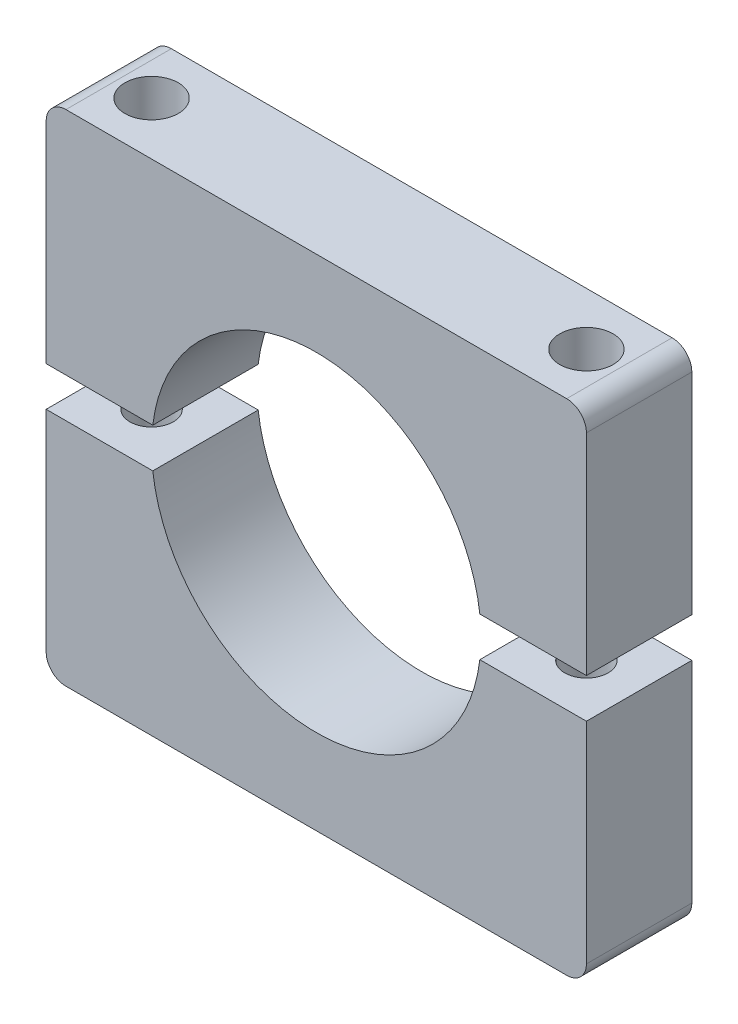
ISO-10303-21;
HEADER;
FILE_DESCRIPTION(('STEP AP214'),'2;1');
FILE_NAME('part.step','',(''),(''),'','','');
FILE_SCHEMA(('AUTOMOTIVE_DESIGN { 1 0 10303 214 1 1 1 1 }'));
ENDSEC;
DATA;
#1=APPLICATION_CONTEXT('core data for automotive mechanical design processes');
#2=APPLICATION_PROTOCOL_DEFINITION('international standard','automotive_design',2000,#1);
#3=PRODUCT_CONTEXT('',#1,'mechanical');
#4=PRODUCT('Part','Part','',(#3));
#5=PRODUCT_RELATED_PRODUCT_CATEGORY('part','',(#4));
#6=PRODUCT_DEFINITION_FORMATION('','',#4);
#7=PRODUCT_DEFINITION_CONTEXT('part definition',#1,'design');
#8=PRODUCT_DEFINITION('design','',#6,#7);
#9=PRODUCT_DEFINITION_SHAPE('','',#8);
#10=(LENGTH_UNIT() NAMED_UNIT(*) SI_UNIT(.MILLI.,.METRE.));
#11=(NAMED_UNIT(*) PLANE_ANGLE_UNIT() SI_UNIT($,.RADIAN.));
#12=(NAMED_UNIT(*) SI_UNIT($,.STERADIAN.) SOLID_ANGLE_UNIT());
#13=UNCERTAINTY_MEASURE_WITH_UNIT(LENGTH_MEASURE(1.E-05),#10,'distance_accuracy_value','');
#14=(GEOMETRIC_REPRESENTATION_CONTEXT(3) GLOBAL_UNCERTAINTY_ASSIGNED_CONTEXT((#13)) GLOBAL_UNIT_ASSIGNED_CONTEXT((#10,
#11,#12)) REPRESENTATION_CONTEXT('',''));
#15=CARTESIAN_POINT('',(0.,0.,0.));
#16=DIRECTION('',(0.,0.,1.));
#17=DIRECTION('',(1.,0.,0.));
#18=AXIS2_PLACEMENT_3D('',#15,#16,#17);
#19=CARTESIAN_POINT('',(0.,0.,4.));
#20=DIRECTION('',(0.,0.,-1.));
#21=DIRECTION('',(-1.,0.,0.));
#22=AXIS2_PLACEMENT_3D('',#19,#20,#21);
#23=PLANE('',#22);
#24=DIRECTION('',(0.,1.,0.));
#25=VECTOR('',#24,1.);
#26=CARTESIAN_POINT('',(20.5,-18.95,4.));
#27=LINE('',#26,#25);
#28=CARTESIAN_POINT('',(20.5,-17.45,4.));
#29=VERTEX_POINT('',#28);
#30=CARTESIAN_POINT('',(20.5,-1.5,4.));
#31=VERTEX_POINT('',#30);
#32=EDGE_CURVE('E118',#29,#31,#27,.T.);
#33=ORIENTED_EDGE('',*,*,#32,.T.);
#34=DIRECTION('',(-1.,0.,0.));
#35=VECTOR('',#34,1.);
#36=CARTESIAN_POINT('',(0.,-1.5,4.));
#37=LINE('',#36,#35);
#38=CARTESIAN_POINT('',(12.4096736459909,-1.5,4.));
#39=VERTEX_POINT('',#38);
#40=EDGE_CURVE('E132',#31,#39,#37,.T.);
#41=ORIENTED_EDGE('',*,*,#40,.T.);
#42=CARTESIAN_POINT('',(0.,0.,4.));
#43=DIRECTION('',(0.,0.,1.));
#44=DIRECTION('',(1.,0.,0.));
#45=AXIS2_PLACEMENT_3D('',#42,#43,#44);
#46=CIRCLE('',#45,12.5);
#47=CARTESIAN_POINT('',(-12.4096736459909,-1.5,4.));
#48=VERTEX_POINT('',#47);
#49=EDGE_CURVE('E150',#48,#39,#46,.T.);
#50=ORIENTED_EDGE('',*,*,#49,.F.);
#51=CARTESIAN_POINT('',(-20.5,-1.5,4.));
#52=VERTEX_POINT('',#51);
#53=EDGE_CURVE('E87',#48,#52,#37,.T.);
#54=ORIENTED_EDGE('',*,*,#53,.T.);
#55=DIRECTION('',(0.,-1.,0.));
#56=VECTOR('',#55,1.);
#57=CARTESIAN_POINT('',(-20.5,-18.95,4.));
#58=LINE('',#57,#56);
#59=CARTESIAN_POINT('',(-20.5,-17.45,4.));
#60=VERTEX_POINT('',#59);
#61=EDGE_CURVE('E156',#52,#60,#58,.T.);
#62=ORIENTED_EDGE('',*,*,#61,.T.);
#63=CARTESIAN_POINT('',(-19.,-17.45,4.));
#64=DIRECTION('',(0.,0.,-1.));
#65=DIRECTION('',(-1.,0.,0.));
#66=AXIS2_PLACEMENT_3D('',#63,#64,#65);
#67=CIRCLE('',#66,1.5);
#68=CARTESIAN_POINT('',(-19.,-18.95,4.));
#69=VERTEX_POINT('',#68);
#70=EDGE_CURVE('E151',#60,#69,#67,.F.);
#71=ORIENTED_EDGE('',*,*,#70,.T.);
#72=DIRECTION('',(1.,0.,0.));
#73=VECTOR('',#72,1.);
#74=CARTESIAN_POINT('',(-20.5,-18.95,4.));
#75=LINE('',#74,#73);
#76=CARTESIAN_POINT('',(19.,-18.95,4.));
#77=VERTEX_POINT('',#76);
#78=EDGE_CURVE('E120',#69,#77,#75,.T.);
#79=ORIENTED_EDGE('',*,*,#78,.T.);
#80=CARTESIAN_POINT('',(19.,-17.45,4.));
#81=DIRECTION('',(0.,0.,-1.));
#82=DIRECTION('',(-1.,0.,0.));
#83=AXIS2_PLACEMENT_3D('',#80,#81,#82);
#84=CIRCLE('',#83,1.5);
#85=EDGE_CURVE('E115',#77,#29,#84,.F.);
#86=ORIENTED_EDGE('',*,*,#85,.T.);
#87=EDGE_LOOP('',(#33,#41,#50,#54,#62,#71,#79,#86));
#88=FACE_BOUND('',#87,.T.);
#89=ADVANCED_FACE('F48',(#88),#23,.F.);
#90=CARTESIAN_POINT('',(0.,0.,-4.));
#91=DIRECTION('',(0.,0.,-1.));
#92=DIRECTION('',(-1.,0.,0.));
#93=AXIS2_PLACEMENT_3D('',#90,#91,#92);
#94=PLANE('',#93);
#95=DIRECTION('',(-1.,0.,0.));
#96=VECTOR('',#95,1.);
#97=CARTESIAN_POINT('',(0.,-1.5,-4.));
#98=LINE('',#97,#96);
#99=CARTESIAN_POINT('',(20.5,-1.5,-4.));
#100=VERTEX_POINT('',#99);
#101=CARTESIAN_POINT('',(12.4096736459909,-1.5,-4.));
#102=VERTEX_POINT('',#101);
#103=EDGE_CURVE('E59',#100,#102,#98,.T.);
#104=ORIENTED_EDGE('',*,*,#103,.F.);
#105=DIRECTION('',(0.,1.,0.));
#106=VECTOR('',#105,1.);
#107=CARTESIAN_POINT('',(20.5,-18.95,-4.));
#108=LINE('',#107,#106);
#109=CARTESIAN_POINT('',(20.5,-17.45,-4.));
#110=VERTEX_POINT('',#109);
#111=EDGE_CURVE('E140',#110,#100,#108,.T.);
#112=ORIENTED_EDGE('',*,*,#111,.F.);
#113=CARTESIAN_POINT('',(19.,-17.45,-4.));
#114=DIRECTION('',(0.,0.,-1.));
#115=DIRECTION('',(-1.,0.,0.));
#116=AXIS2_PLACEMENT_3D('',#113,#114,#115);
#117=CIRCLE('',#116,1.5);
#118=CARTESIAN_POINT('',(19.,-18.95,-4.));
#119=VERTEX_POINT('',#118);
#120=EDGE_CURVE('E124',#110,#119,#117,.T.);
#121=ORIENTED_EDGE('',*,*,#120,.T.);
#122=DIRECTION('',(1.,0.,0.));
#123=VECTOR('',#122,1.);
#124=CARTESIAN_POINT('',(-20.5,-18.95,-4.));
#125=LINE('',#124,#123);
#126=CARTESIAN_POINT('',(-19.,-18.95,-4.));
#127=VERTEX_POINT('',#126);
#128=EDGE_CURVE('E146',#127,#119,#125,.T.);
#129=ORIENTED_EDGE('',*,*,#128,.F.);
#130=CARTESIAN_POINT('',(-19.,-17.45,-4.));
#131=DIRECTION('',(0.,0.,-1.));
#132=DIRECTION('',(-1.,0.,0.));
#133=AXIS2_PLACEMENT_3D('',#130,#131,#132);
#134=CIRCLE('',#133,1.5);
#135=CARTESIAN_POINT('',(-20.5,-17.45,-4.));
#136=VERTEX_POINT('',#135);
#137=EDGE_CURVE('E144',#127,#136,#134,.T.);
#138=ORIENTED_EDGE('',*,*,#137,.T.);
#139=DIRECTION('',(0.,-1.,0.));
#140=VECTOR('',#139,1.);
#141=CARTESIAN_POINT('',(-20.5,-18.95,-4.));
#142=LINE('',#141,#140);
#143=CARTESIAN_POINT('',(-20.5,-1.5,-4.));
#144=VERTEX_POINT('',#143);
#145=EDGE_CURVE('E138',#144,#136,#142,.T.);
#146=ORIENTED_EDGE('',*,*,#145,.F.);
#147=CARTESIAN_POINT('',(-12.4096736459909,-1.5,-4.));
#148=VERTEX_POINT('',#147);
#149=EDGE_CURVE('E12',#148,#144,#98,.T.);
#150=ORIENTED_EDGE('',*,*,#149,.F.);
#151=CARTESIAN_POINT('',(0.,0.,-4.));
#152=DIRECTION('',(0.,0.,1.));
#153=DIRECTION('',(1.,0.,0.));
#154=AXIS2_PLACEMENT_3D('',#151,#152,#153);
#155=CIRCLE('',#154,12.5);
#156=EDGE_CURVE('E51',#148,#102,#155,.T.);
#157=ORIENTED_EDGE('',*,*,#156,.T.);
#158=EDGE_LOOP('',(#104,#112,#121,#129,#138,#146,#150,#157));
#159=FACE_BOUND('',#158,.T.);
#160=ADVANCED_FACE('F183',(#159),#94,.T.);
#161=CARTESIAN_POINT('',(20.5,-18.95,4.));
#162=DIRECTION('',(-1.,0.,0.));
#163=DIRECTION('',(0.,0.,1.));
#164=AXIS2_PLACEMENT_3D('',#161,#162,#163);
#165=PLANE('',#164);
#166=ORIENTED_EDGE('',*,*,#111,.T.);
#167=DIRECTION('',(0.,0.,1.));
#168=VECTOR('',#167,1.);
#169=CARTESIAN_POINT('',(20.5,-1.5,4.));
#170=LINE('',#169,#168);
#171=EDGE_CURVE('E84',#100,#31,#170,.T.);
#172=ORIENTED_EDGE('',*,*,#171,.T.);
#173=ORIENTED_EDGE('',*,*,#32,.F.);
#174=DIRECTION('',(0.,0.,-1.));
#175=VECTOR('',#174,1.);
#176=CARTESIAN_POINT('',(20.5,-17.45,4.));
#177=LINE('',#176,#175);
#178=EDGE_CURVE('E130',#29,#110,#177,.T.);
#179=ORIENTED_EDGE('',*,*,#178,.T.);
#180=EDGE_LOOP('',(#166,#172,#173,#179));
#181=FACE_BOUND('',#180,.T.);
#182=ADVANCED_FACE('F129',(#181),#165,.F.);
#183=CARTESIAN_POINT('',(-20.5,-18.95,4.));
#184=DIRECTION('',(1.,0.,0.));
#185=DIRECTION('',(0.,0.,-1.));
#186=AXIS2_PLACEMENT_3D('',#183,#184,#185);
#187=PLANE('',#186);
#188=ORIENTED_EDGE('',*,*,#61,.F.);
#189=DIRECTION('',(0.,0.,-1.));
#190=VECTOR('',#189,1.);
#191=CARTESIAN_POINT('',(-20.5,-1.5,4.));
#192=LINE('',#191,#190);
#193=EDGE_CURVE('E66',#52,#144,#192,.T.);
#194=ORIENTED_EDGE('',*,*,#193,.T.);
#195=ORIENTED_EDGE('',*,*,#145,.T.);
#196=DIRECTION('',(0.,0.,-1.));
#197=VECTOR('',#196,1.);
#198=CARTESIAN_POINT('',(-20.5,-17.45,4.));
#199=LINE('',#198,#197);
#200=EDGE_CURVE('E159',#136,#60,#199,.F.);
#201=ORIENTED_EDGE('',*,*,#200,.T.);
#202=EDGE_LOOP('',(#188,#194,#195,#201));
#203=FACE_BOUND('',#202,.T.);
#204=ADVANCED_FACE('F223',(#203),#187,.F.);
#205=CARTESIAN_POINT('',(0.,0.,4.));
#206=DIRECTION('',(0.,0.,-1.));
#207=DIRECTION('',(-1.,0.,0.));
#208=AXIS2_PLACEMENT_3D('',#205,#206,#207);
#209=CYLINDRICAL_SURFACE('',#208,12.5);
#210=DIRECTION('',(0.,0.,-1.));
#211=VECTOR('',#210,1.);
#212=CARTESIAN_POINT('',(-12.4096736459909,-1.5,4.));
#213=LINE('',#212,#211);
#214=EDGE_CURVE('E57',#48,#148,#213,.T.);
#215=ORIENTED_EDGE('',*,*,#214,.F.);
#216=ORIENTED_EDGE('',*,*,#49,.T.);
#217=DIRECTION('',(0.,0.,-1.));
#218=VECTOR('',#217,1.);
#219=CARTESIAN_POINT('',(12.4096736459909,-1.5,4.));
#220=LINE('',#219,#218);
#221=EDGE_CURVE('E154',#102,#39,#220,.F.);
#222=ORIENTED_EDGE('',*,*,#221,.F.);
#223=ORIENTED_EDGE('',*,*,#156,.F.);
#224=EDGE_LOOP('',(#215,#216,#222,#223));
#225=FACE_BOUND('',#224,.T.);
#226=ADVANCED_FACE('F184',(#225),#209,.F.);
#227=CARTESIAN_POINT('',(-20.5,-18.95,4.));
#228=DIRECTION('',(0.,1.,0.));
#229=DIRECTION('',(0.,0.,1.));
#230=AXIS2_PLACEMENT_3D('',#227,#228,#229);
#231=PLANE('',#230);
#232=CARTESIAN_POINT('',(-16.5,-18.95,0.));
#233=DIRECTION('',(0.,1.,0.));
#234=DIRECTION('',(0.,0.,1.));
#235=AXIS2_PLACEMENT_3D('',#232,#233,#234);
#236=CIRCLE('',#235,1.65);
#237=CARTESIAN_POINT('',(-16.5,-18.95,1.65));
#238=VERTEX_POINT('',#237);
#239=EDGE_CURVE('E192',#238,#238,#236,.T.);
#240=ORIENTED_EDGE('',*,*,#239,.T.);
#241=EDGE_LOOP('',(#240));
#242=FACE_BOUND('',#241,.T.);
#243=CARTESIAN_POINT('',(16.5,-18.95,0.));
#244=DIRECTION('',(0.,1.,0.));
#245=DIRECTION('',(0.,0.,1.));
#246=AXIS2_PLACEMENT_3D('',#243,#244,#245);
#247=CIRCLE('',#246,1.65);
#248=CARTESIAN_POINT('',(16.5,-18.95,1.65));
#249=VERTEX_POINT('',#248);
#250=EDGE_CURVE('E133',#249,#249,#247,.T.);
#251=ORIENTED_EDGE('',*,*,#250,.T.);
#252=EDGE_LOOP('',(#251));
#253=FACE_BOUND('',#252,.T.);
#254=ORIENTED_EDGE('',*,*,#128,.T.);
#255=DIRECTION('',(0.,0.,-1.));
#256=VECTOR('',#255,1.);
#257=CARTESIAN_POINT('',(19.,-18.95,4.));
#258=LINE('',#257,#256);
#259=EDGE_CURVE('E149',#119,#77,#258,.F.);
#260=ORIENTED_EDGE('',*,*,#259,.T.);
#261=ORIENTED_EDGE('',*,*,#78,.F.);
#262=DIRECTION('',(0.,0.,-1.));
#263=VECTOR('',#262,1.);
#264=CARTESIAN_POINT('',(-19.,-18.95,4.));
#265=LINE('',#264,#263);
#266=EDGE_CURVE('E155',#69,#127,#265,.T.);
#267=ORIENTED_EDGE('',*,*,#266,.T.);
#268=EDGE_LOOP('',(#254,#260,#261,#267));
#269=FACE_BOUND('',#268,.T.);
#270=ADVANCED_FACE('F228',(#242,#253,#269),#231,.F.);
#271=CARTESIAN_POINT('',(19.,-17.45,4.));
#272=DIRECTION('',(0.,0.,-1.));
#273=DIRECTION('',(-1.,0.,0.));
#274=AXIS2_PLACEMENT_3D('',#271,#272,#273);
#275=CYLINDRICAL_SURFACE('',#274,1.5);
#276=ORIENTED_EDGE('',*,*,#85,.F.);
#277=ORIENTED_EDGE('',*,*,#259,.F.);
#278=ORIENTED_EDGE('',*,*,#120,.F.);
#279=ORIENTED_EDGE('',*,*,#178,.F.);
#280=EDGE_LOOP('',(#276,#277,#278,#279));
#281=FACE_BOUND('',#280,.T.);
#282=ADVANCED_FACE('F136',(#281),#275,.T.);
#283=CARTESIAN_POINT('',(-19.,-17.45,4.));
#284=DIRECTION('',(0.,0.,-1.));
#285=DIRECTION('',(-1.,0.,0.));
#286=AXIS2_PLACEMENT_3D('',#283,#284,#285);
#287=CYLINDRICAL_SURFACE('',#286,1.5);
#288=ORIENTED_EDGE('',*,*,#70,.F.);
#289=ORIENTED_EDGE('',*,*,#200,.F.);
#290=ORIENTED_EDGE('',*,*,#137,.F.);
#291=ORIENTED_EDGE('',*,*,#266,.F.);
#292=EDGE_LOOP('',(#288,#289,#290,#291));
#293=FACE_BOUND('',#292,.T.);
#294=ADVANCED_FACE('F212',(#293),#287,.T.);
#295=CARTESIAN_POINT('',(-25.,-1.5,-15.));
#296=DIRECTION('',(0.,-1.,0.));
#297=DIRECTION('',(0.,0.,-1.));
#298=AXIS2_PLACEMENT_3D('',#295,#296,#297);
#299=PLANE('',#298);
#300=CARTESIAN_POINT('',(16.5,-1.5,0.));
#301=DIRECTION('',(0.,1.,0.));
#302=DIRECTION('',(0.,0.,1.));
#303=AXIS2_PLACEMENT_3D('',#300,#301,#302);
#304=CIRCLE('',#303,1.64999999999999);
#305=CARTESIAN_POINT('',(16.5,-1.5,1.64999999999999));
#306=VERTEX_POINT('',#305);
#307=EDGE_CURVE('E189',#306,#306,#304,.T.);
#308=ORIENTED_EDGE('',*,*,#307,.F.);
#309=EDGE_LOOP('',(#308));
#310=FACE_BOUND('',#309,.T.);
#311=ORIENTED_EDGE('',*,*,#103,.T.);
#312=ORIENTED_EDGE('',*,*,#221,.T.);
#313=ORIENTED_EDGE('',*,*,#40,.F.);
#314=ORIENTED_EDGE('',*,*,#171,.F.);
#315=EDGE_LOOP('',(#311,#312,#313,#314));
#316=FACE_BOUND('',#315,.T.);
#317=ADVANCED_FACE('F204',(#310,#316),#299,.F.);
#318=CARTESIAN_POINT('',(-16.5,-1.5,0.));
#319=DIRECTION('',(0.,1.,0.));
#320=DIRECTION('',(0.,0.,1.));
#321=AXIS2_PLACEMENT_3D('',#318,#319,#320);
#322=CIRCLE('',#321,1.64999999999999);
#323=CARTESIAN_POINT('',(-16.5,-1.5,1.64999999999999));
#324=VERTEX_POINT('',#323);
#325=EDGE_CURVE('E195',#324,#324,#322,.T.);
#326=ORIENTED_EDGE('',*,*,#325,.F.);
#327=EDGE_LOOP('',(#326));
#328=FACE_BOUND('',#327,.T.);
#329=ORIENTED_EDGE('',*,*,#53,.F.);
#330=ORIENTED_EDGE('',*,*,#214,.T.);
#331=ORIENTED_EDGE('',*,*,#149,.T.);
#332=ORIENTED_EDGE('',*,*,#193,.F.);
#333=EDGE_LOOP('',(#329,#330,#331,#332));
#334=FACE_BOUND('',#333,.T.);
#335=ADVANCED_FACE('F201',(#328,#334),#299,.F.);
#336=CARTESIAN_POINT('',(16.5,-1.5,0.));
#337=DIRECTION('',(0.,1.,0.));
#338=DIRECTION('',(0.,0.,1.));
#339=AXIS2_PLACEMENT_3D('',#336,#337,#338);
#340=CYLINDRICAL_SURFACE('',#339,1.64999999999999);
#341=ORIENTED_EDGE('',*,*,#250,.F.);
#342=EDGE_LOOP('',(#341));
#343=FACE_BOUND('',#342,.T.);
#344=ORIENTED_EDGE('',*,*,#307,.T.);
#345=EDGE_LOOP('',(#344));
#346=FACE_BOUND('',#345,.T.);
#347=ADVANCED_FACE('F203',(#343,#346),#340,.F.);
#348=CARTESIAN_POINT('',(-16.5,-1.5,0.));
#349=DIRECTION('',(0.,1.,0.));
#350=DIRECTION('',(0.,0.,1.));
#351=AXIS2_PLACEMENT_3D('',#348,#349,#350);
#352=CYLINDRICAL_SURFACE('',#351,1.64999999999999);
#353=ORIENTED_EDGE('',*,*,#239,.F.);
#354=EDGE_LOOP('',(#353));
#355=FACE_BOUND('',#354,.T.);
#356=ORIENTED_EDGE('',*,*,#325,.T.);
#357=EDGE_LOOP('',(#356));
#358=FACE_BOUND('',#357,.T.);
#359=ADVANCED_FACE('F199',(#355,#358),#352,.F.);
#360=CLOSED_SHELL('',(#89,#160,#182,#204,#226,#270,#282,#294,#317,#335,#347,#359));
#361=MANIFOLD_SOLID_BREP('B2',#360);
#362=CARTESIAN_POINT('',(-20.5,18.95,4.));
#363=DIRECTION('',(0.,-1.,0.));
#364=DIRECTION('',(0.,0.,-1.));
#365=AXIS2_PLACEMENT_3D('',#362,#363,#364);
#366=PLANE('',#365);
#367=CARTESIAN_POINT('',(16.5,18.95,0.));
#368=DIRECTION('',(0.,-1.,0.));
#369=DIRECTION('',(0.,0.,-1.));
#370=AXIS2_PLACEMENT_3D('',#367,#368,#369);
#371=CIRCLE('',#370,2.025);
#372=CARTESIAN_POINT('',(16.5,18.95,-2.025));
#373=VERTEX_POINT('',#372);
#374=EDGE_CURVE('E442',#373,#373,#371,.T.);
#375=ORIENTED_EDGE('',*,*,#374,.T.);
#376=EDGE_LOOP('',(#375));
#377=FACE_BOUND('',#376,.T.);
#378=CARTESIAN_POINT('',(-16.5,18.95,0.));
#379=DIRECTION('',(0.,-1.,0.));
#380=DIRECTION('',(0.,0.,-1.));
#381=AXIS2_PLACEMENT_3D('',#378,#379,#380);
#382=CIRCLE('',#381,2.025);
#383=CARTESIAN_POINT('',(-16.5,18.95,-2.02499999999999));
#384=VERTEX_POINT('',#383);
#385=EDGE_CURVE('E450',#384,#384,#382,.T.);
#386=ORIENTED_EDGE('',*,*,#385,.T.);
#387=EDGE_LOOP('',(#386));
#388=FACE_BOUND('',#387,.T.);
#389=DIRECTION('',(-1.,0.,0.));
#390=VECTOR('',#389,1.);
#391=CARTESIAN_POINT('',(-20.5,18.95,-4.));
#392=LINE('',#391,#390);
#393=CARTESIAN_POINT('',(19.,18.95,-4.));
#394=VERTEX_POINT('',#393);
#395=CARTESIAN_POINT('',(-19.,18.95,-4.));
#396=VERTEX_POINT('',#395);
#397=EDGE_CURVE('E404',#394,#396,#392,.T.);
#398=ORIENTED_EDGE('',*,*,#397,.T.);
#399=DIRECTION('',(0.,0.,-1.));
#400=VECTOR('',#399,1.);
#401=CARTESIAN_POINT('',(-19.,18.95,4.));
#402=LINE('',#401,#400);
#403=CARTESIAN_POINT('',(-19.,18.95,4.));
#404=VERTEX_POINT('',#403);
#405=EDGE_CURVE('E389',#396,#404,#402,.F.);
#406=ORIENTED_EDGE('',*,*,#405,.T.);
#407=DIRECTION('',(-1.,0.,0.));
#408=VECTOR('',#407,1.);
#409=CARTESIAN_POINT('',(-20.5,18.95,4.));
#410=LINE('',#409,#408);
#411=CARTESIAN_POINT('',(19.,18.95,4.));
#412=VERTEX_POINT('',#411);
#413=EDGE_CURVE('E413',#412,#404,#410,.T.);
#414=ORIENTED_EDGE('',*,*,#413,.F.);
#415=DIRECTION('',(0.,0.,-1.));
#416=VECTOR('',#415,1.);
#417=CARTESIAN_POINT('',(19.,18.95,4.));
#418=LINE('',#417,#416);
#419=EDGE_CURVE('E437',#412,#394,#418,.T.);
#420=ORIENTED_EDGE('',*,*,#419,.T.);
#421=EDGE_LOOP('',(#398,#406,#414,#420));
#422=FACE_BOUND('',#421,.T.);
#423=ADVANCED_FACE('F318',(#377,#388,#422),#366,.F.);
#424=CARTESIAN_POINT('',(19.,17.45,4.));
#425=DIRECTION('',(0.,0.,-1.));
#426=DIRECTION('',(-1.,0.,0.));
#427=AXIS2_PLACEMENT_3D('',#424,#425,#426);
#428=CYLINDRICAL_SURFACE('',#427,1.5);
#429=CARTESIAN_POINT('',(19.,17.45,4.));
#430=DIRECTION('',(0.,0.,-1.));
#431=DIRECTION('',(-1.,0.,0.));
#432=AXIS2_PLACEMENT_3D('',#429,#430,#431);
#433=CIRCLE('',#432,1.5);
#434=CARTESIAN_POINT('',(20.5,17.45,4.));
#435=VERTEX_POINT('',#434);
#436=EDGE_CURVE('E430',#435,#412,#433,.F.);
#437=ORIENTED_EDGE('',*,*,#436,.F.);
#438=DIRECTION('',(0.,0.,-1.));
#439=VECTOR('',#438,1.);
#440=CARTESIAN_POINT('',(20.5,17.45,4.));
#441=LINE('',#440,#439);
#442=CARTESIAN_POINT('',(20.5,17.45,-4.));
#443=VERTEX_POINT('',#442);
#444=EDGE_CURVE('E417',#443,#435,#441,.F.);
#445=ORIENTED_EDGE('',*,*,#444,.F.);
#446=CARTESIAN_POINT('',(19.,17.45,-4.));
#447=DIRECTION('',(0.,0.,-1.));
#448=DIRECTION('',(-1.,0.,0.));
#449=AXIS2_PLACEMENT_3D('',#446,#447,#448);
#450=CIRCLE('',#449,1.5);
#451=EDGE_CURVE('E425',#394,#443,#450,.T.);
#452=ORIENTED_EDGE('',*,*,#451,.F.);
#453=ORIENTED_EDGE('',*,*,#419,.F.);
#454=EDGE_LOOP('',(#437,#445,#452,#453));
#455=FACE_BOUND('',#454,.T.);
#456=ADVANCED_FACE('F320',(#455),#428,.T.);
#457=CARTESIAN_POINT('',(-19.,17.45,4.));
#458=DIRECTION('',(0.,0.,-1.));
#459=DIRECTION('',(-1.,0.,0.));
#460=AXIS2_PLACEMENT_3D('',#457,#458,#459);
#461=CYLINDRICAL_SURFACE('',#460,1.5);
#462=CARTESIAN_POINT('',(-19.,17.45,4.));
#463=DIRECTION('',(0.,0.,-1.));
#464=DIRECTION('',(-1.,0.,0.));
#465=AXIS2_PLACEMENT_3D('',#462,#463,#464);
#466=CIRCLE('',#465,1.5);
#467=CARTESIAN_POINT('',(-20.5,17.45,4.));
#468=VERTEX_POINT('',#467);
#469=EDGE_CURVE('E432',#404,#468,#466,.F.);
#470=ORIENTED_EDGE('',*,*,#469,.F.);
#471=ORIENTED_EDGE('',*,*,#405,.F.);
#472=CARTESIAN_POINT('',(-19.,17.45,-4.));
#473=DIRECTION('',(0.,0.,-1.));
#474=DIRECTION('',(-1.,0.,0.));
#475=AXIS2_PLACEMENT_3D('',#472,#473,#474);
#476=CIRCLE('',#475,1.5);
#477=CARTESIAN_POINT('',(-20.5,17.45,-4.));
#478=VERTEX_POINT('',#477);
#479=EDGE_CURVE('E428',#478,#396,#476,.T.);
#480=ORIENTED_EDGE('',*,*,#479,.F.);
#481=DIRECTION('',(0.,0.,-1.));
#482=VECTOR('',#481,1.);
#483=CARTESIAN_POINT('',(-20.5,17.45,4.));
#484=LINE('',#483,#482);
#485=EDGE_CURVE('E434',#468,#478,#484,.T.);
#486=ORIENTED_EDGE('',*,*,#485,.F.);
#487=EDGE_LOOP('',(#470,#471,#480,#486));
#488=FACE_BOUND('',#487,.T.);
#489=ADVANCED_FACE('F474',(#488),#461,.T.);
#490=CARTESIAN_POINT('',(0.,0.,4.));
#491=DIRECTION('',(0.,0.,-1.));
#492=DIRECTION('',(-1.,0.,0.));
#493=AXIS2_PLACEMENT_3D('',#490,#491,#492);
#494=CYLINDRICAL_SURFACE('',#493,12.5);
#495=DIRECTION('',(0.,0.,-1.));
#496=VECTOR('',#495,1.);
#497=CARTESIAN_POINT('',(12.4096736459909,1.5,4.));
#498=LINE('',#497,#496);
#499=CARTESIAN_POINT('',(12.4096736459909,1.5,4.));
#500=VERTEX_POINT('',#499);
#501=CARTESIAN_POINT('',(12.4096736459909,1.5,-4.));
#502=VERTEX_POINT('',#501);
#503=EDGE_CURVE('E46',#500,#502,#498,.T.);
#504=ORIENTED_EDGE('',*,*,#503,.F.);
#505=CARTESIAN_POINT('',(0.,0.,4.));
#506=DIRECTION('',(0.,0.,1.));
#507=DIRECTION('',(1.,0.,0.));
#508=AXIS2_PLACEMENT_3D('',#505,#506,#507);
#509=CIRCLE('',#508,12.5);
#510=CARTESIAN_POINT('',(-12.4096736459909,1.5,4.));
#511=VERTEX_POINT('',#510);
#512=EDGE_CURVE('E395',#500,#511,#509,.T.);
#513=ORIENTED_EDGE('',*,*,#512,.T.);
#514=DIRECTION('',(0.,0.,-1.));
#515=VECTOR('',#514,1.);
#516=CARTESIAN_POINT('',(-12.4096736459909,1.5,4.));
#517=LINE('',#516,#515);
#518=CARTESIAN_POINT('',(-12.4096736459909,1.5,-4.));
#519=VERTEX_POINT('',#518);
#520=EDGE_CURVE('E327',#519,#511,#517,.F.);
#521=ORIENTED_EDGE('',*,*,#520,.F.);
#522=CARTESIAN_POINT('',(0.,0.,-4.));
#523=DIRECTION('',(0.,0.,1.));
#524=DIRECTION('',(1.,0.,0.));
#525=AXIS2_PLACEMENT_3D('',#522,#523,#524);
#526=CIRCLE('',#525,12.5);
#527=EDGE_CURVE('E402',#502,#519,#526,.T.);
#528=ORIENTED_EDGE('',*,*,#527,.F.);
#529=EDGE_LOOP('',(#504,#513,#521,#528));
#530=FACE_BOUND('',#529,.T.);
#531=ADVANCED_FACE('F400',(#530),#494,.F.);
#532=CARTESIAN_POINT('',(20.5,-18.95,4.));
#533=DIRECTION('',(-1.,0.,0.));
#534=DIRECTION('',(0.,0.,1.));
#535=AXIS2_PLACEMENT_3D('',#532,#533,#534);
#536=PLANE('',#535);
#537=DIRECTION('',(0.,1.,0.));
#538=VECTOR('',#537,1.);
#539=CARTESIAN_POINT('',(20.5,-18.95,4.));
#540=LINE('',#539,#538);
#541=CARTESIAN_POINT('',(20.5,1.5,4.));
#542=VERTEX_POINT('',#541);
#543=EDGE_CURVE('E411',#542,#435,#540,.T.);
#544=ORIENTED_EDGE('',*,*,#543,.F.);
#545=DIRECTION('',(0.,0.,-1.));
#546=VECTOR('',#545,1.);
#547=CARTESIAN_POINT('',(20.5,1.5,4.));
#548=LINE('',#547,#546);
#549=CARTESIAN_POINT('',(20.5,1.5,-4.));
#550=VERTEX_POINT('',#549);
#551=EDGE_CURVE('E406',#542,#550,#548,.T.);
#552=ORIENTED_EDGE('',*,*,#551,.T.);
#553=DIRECTION('',(0.,1.,0.));
#554=VECTOR('',#553,1.);
#555=CARTESIAN_POINT('',(20.5,-18.95,-4.));
#556=LINE('',#555,#554);
#557=EDGE_CURVE('E401',#550,#443,#556,.T.);
#558=ORIENTED_EDGE('',*,*,#557,.T.);
#559=ORIENTED_EDGE('',*,*,#444,.T.);
#560=EDGE_LOOP('',(#544,#552,#558,#559));
#561=FACE_BOUND('',#560,.T.);
#562=ADVANCED_FACE('F461',(#561),#536,.F.);
#563=CARTESIAN_POINT('',(-20.5,-18.95,4.));
#564=DIRECTION('',(1.,0.,0.));
#565=DIRECTION('',(0.,0.,-1.));
#566=AXIS2_PLACEMENT_3D('',#563,#564,#565);
#567=PLANE('',#566);
#568=DIRECTION('',(0.,-1.,0.));
#569=VECTOR('',#568,1.);
#570=CARTESIAN_POINT('',(-20.5,-18.95,-4.));
#571=LINE('',#570,#569);
#572=CARTESIAN_POINT('',(-20.5,1.5,-4.));
#573=VERTEX_POINT('',#572);
#574=EDGE_CURVE('E414',#478,#573,#571,.T.);
#575=ORIENTED_EDGE('',*,*,#574,.T.);
#576=DIRECTION('',(0.,0.,1.));
#577=VECTOR('',#576,1.);
#578=CARTESIAN_POINT('',(-20.5,1.5,4.));
#579=LINE('',#578,#577);
#580=CARTESIAN_POINT('',(-20.5,1.5,4.));
#581=VERTEX_POINT('',#580);
#582=EDGE_CURVE('E398',#573,#581,#579,.T.);
#583=ORIENTED_EDGE('',*,*,#582,.T.);
#584=DIRECTION('',(0.,-1.,0.));
#585=VECTOR('',#584,1.);
#586=CARTESIAN_POINT('',(-20.5,-18.95,4.));
#587=LINE('',#586,#585);
#588=EDGE_CURVE('E397',#468,#581,#587,.T.);
#589=ORIENTED_EDGE('',*,*,#588,.F.);
#590=ORIENTED_EDGE('',*,*,#485,.T.);
#591=EDGE_LOOP('',(#575,#583,#589,#590));
#592=FACE_BOUND('',#591,.T.);
#593=ADVANCED_FACE('F476',(#592),#567,.F.);
#594=CARTESIAN_POINT('',(0.,0.,-4.));
#595=DIRECTION('',(0.,0.,-1.));
#596=DIRECTION('',(-1.,0.,0.));
#597=AXIS2_PLACEMENT_3D('',#594,#595,#596);
#598=PLANE('',#597);
#599=DIRECTION('',(1.,0.,0.));
#600=VECTOR('',#599,1.);
#601=CARTESIAN_POINT('',(0.,1.5,-4.));
#602=LINE('',#601,#600);
#603=EDGE_CURVE('E335',#573,#519,#602,.T.);
#604=ORIENTED_EDGE('',*,*,#603,.F.);
#605=ORIENTED_EDGE('',*,*,#574,.F.);
#606=ORIENTED_EDGE('',*,*,#479,.T.);
#607=ORIENTED_EDGE('',*,*,#397,.F.);
#608=ORIENTED_EDGE('',*,*,#451,.T.);
#609=ORIENTED_EDGE('',*,*,#557,.F.);
#610=EDGE_CURVE('E454',#502,#550,#602,.T.);
#611=ORIENTED_EDGE('',*,*,#610,.F.);
#612=ORIENTED_EDGE('',*,*,#527,.T.);
#613=EDGE_LOOP('',(#604,#605,#606,#607,#608,#609,#611,#612));
#614=FACE_BOUND('',#613,.T.);
#615=ADVANCED_FACE('F463',(#614),#598,.T.);
#616=CARTESIAN_POINT('',(0.,0.,4.));
#617=DIRECTION('',(0.,0.,-1.));
#618=DIRECTION('',(-1.,0.,0.));
#619=AXIS2_PLACEMENT_3D('',#616,#617,#618);
#620=PLANE('',#619);
#621=ORIENTED_EDGE('',*,*,#588,.T.);
#622=DIRECTION('',(1.,0.,0.));
#623=VECTOR('',#622,1.);
#624=CARTESIAN_POINT('',(0.,1.5,4.));
#625=LINE('',#624,#623);
#626=EDGE_CURVE('E383',#581,#511,#625,.T.);
#627=ORIENTED_EDGE('',*,*,#626,.T.);
#628=ORIENTED_EDGE('',*,*,#512,.F.);
#629=EDGE_CURVE('E342',#500,#542,#625,.T.);
#630=ORIENTED_EDGE('',*,*,#629,.T.);
#631=ORIENTED_EDGE('',*,*,#543,.T.);
#632=ORIENTED_EDGE('',*,*,#436,.T.);
#633=ORIENTED_EDGE('',*,*,#413,.T.);
#634=ORIENTED_EDGE('',*,*,#469,.T.);
#635=EDGE_LOOP('',(#621,#627,#628,#630,#631,#632,#633,#634));
#636=FACE_BOUND('',#635,.T.);
#637=ADVANCED_FACE('F394',(#636),#620,.F.);
#638=CARTESIAN_POINT('',(-25.,1.5,-15.));
#639=DIRECTION('',(0.,1.,0.));
#640=DIRECTION('',(0.,0.,1.));
#641=AXIS2_PLACEMENT_3D('',#638,#639,#640);
#642=PLANE('',#641);
#643=CARTESIAN_POINT('',(-16.5,1.5,0.));
#644=DIRECTION('',(0.,1.,0.));
#645=DIRECTION('',(0.,0.,1.));
#646=AXIS2_PLACEMENT_3D('',#643,#644,#645);
#647=CIRCLE('',#646,2.025);
#648=CARTESIAN_POINT('',(-16.5,1.5,2.02500000000001));
#649=VERTEX_POINT('',#648);
#650=EDGE_CURVE('E322',#649,#649,#647,.T.);
#651=ORIENTED_EDGE('',*,*,#650,.T.);
#652=EDGE_LOOP('',(#651));
#653=FACE_BOUND('',#652,.T.);
#654=ORIENTED_EDGE('',*,*,#603,.T.);
#655=ORIENTED_EDGE('',*,*,#520,.T.);
#656=ORIENTED_EDGE('',*,*,#626,.F.);
#657=ORIENTED_EDGE('',*,*,#582,.F.);
#658=EDGE_LOOP('',(#654,#655,#656,#657));
#659=FACE_BOUND('',#658,.T.);
#660=ADVANCED_FACE('F382',(#653,#659),#642,.F.);
#661=CARTESIAN_POINT('',(16.5,1.5,0.));
#662=DIRECTION('',(0.,1.,0.));
#663=DIRECTION('',(0.,0.,1.));
#664=AXIS2_PLACEMENT_3D('',#661,#662,#663);
#665=CIRCLE('',#664,2.025);
#666=CARTESIAN_POINT('',(16.5,1.5,2.025));
#667=VERTEX_POINT('',#666);
#668=EDGE_CURVE('E440',#667,#667,#665,.T.);
#669=ORIENTED_EDGE('',*,*,#668,.T.);
#670=EDGE_LOOP('',(#669));
#671=FACE_BOUND('',#670,.T.);
#672=ORIENTED_EDGE('',*,*,#629,.F.);
#673=ORIENTED_EDGE('',*,*,#503,.T.);
#674=ORIENTED_EDGE('',*,*,#610,.T.);
#675=ORIENTED_EDGE('',*,*,#551,.F.);
#676=EDGE_LOOP('',(#672,#673,#674,#675));
#677=FACE_BOUND('',#676,.T.);
#678=ADVANCED_FACE('F501',(#671,#677),#642,.F.);
#679=CARTESIAN_POINT('',(16.5,-0.0500000000000153,0.));
#680=DIRECTION('',(0.,1.,0.));
#681=DIRECTION('',(0.,0.,1.));
#682=AXIS2_PLACEMENT_3D('',#679,#680,#681);
#683=CYLINDRICAL_SURFACE('',#682,2.025);
#684=ORIENTED_EDGE('',*,*,#668,.F.);
#685=EDGE_LOOP('',(#684));
#686=FACE_BOUND('',#685,.T.);
#687=ORIENTED_EDGE('',*,*,#374,.F.);
#688=EDGE_LOOP('',(#687));
#689=FACE_BOUND('',#688,.T.);
#690=ADVANCED_FACE('F511',(#686,#689),#683,.F.);
#691=CARTESIAN_POINT('',(-16.5,-0.0500000000000153,0.));
#692=DIRECTION('',(0.,1.,0.));
#693=DIRECTION('',(0.,0.,1.));
#694=AXIS2_PLACEMENT_3D('',#691,#692,#693);
#695=CYLINDRICAL_SURFACE('',#694,2.025);
#696=ORIENTED_EDGE('',*,*,#650,.F.);
#697=EDGE_LOOP('',(#696));
#698=FACE_BOUND('',#697,.T.);
#699=ORIENTED_EDGE('',*,*,#385,.F.);
#700=EDGE_LOOP('',(#699));
#701=FACE_BOUND('',#700,.T.);
#702=ADVANCED_FACE('F514',(#698,#701),#695,.F.);
#703=CLOSED_SHELL('',(#423,#456,#489,#531,#562,#593,#615,#637,#660,#678,#690,#702));
#704=MANIFOLD_SOLID_BREP('B6',#703);
#705=ADVANCED_BREP_SHAPE_REPRESENTATION('',(#18,#361,#704),#14);
#706=SHAPE_DEFINITION_REPRESENTATION(#9,#705);
ENDSEC;
END-ISO-10303-21;
